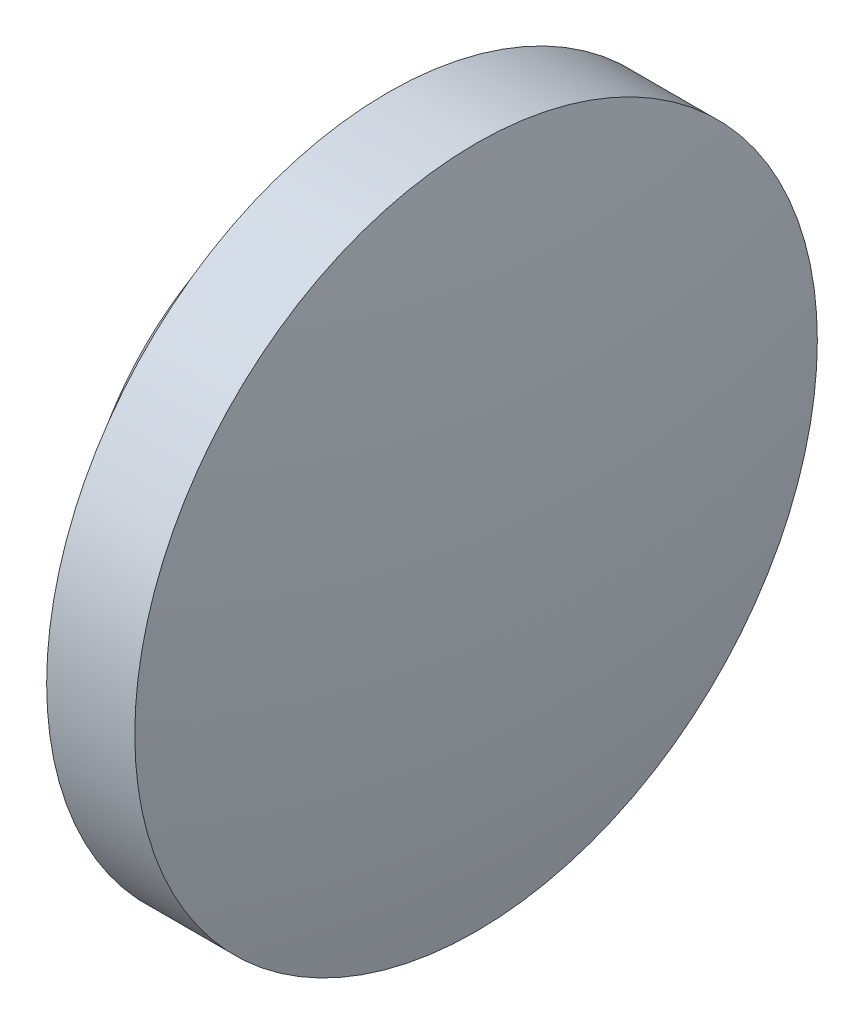
ISO-10303-21;
HEADER;
FILE_DESCRIPTION(('STEP AP214'),'2;1');
FILE_NAME('part.step','',(''),(''),'','','');
FILE_SCHEMA(('AUTOMOTIVE_DESIGN { 1 0 10303 214 1 1 1 1 }'));
ENDSEC;
DATA;
#1=APPLICATION_CONTEXT('core data for automotive mechanical design processes');
#2=APPLICATION_PROTOCOL_DEFINITION('international standard','automotive_design',2000,#1);
#3=PRODUCT_CONTEXT('',#1,'mechanical');
#4=PRODUCT('Part','Part','',(#3));
#5=PRODUCT_RELATED_PRODUCT_CATEGORY('part','',(#4));
#6=PRODUCT_DEFINITION_FORMATION('','',#4);
#7=PRODUCT_DEFINITION_CONTEXT('part definition',#1,'design');
#8=PRODUCT_DEFINITION('design','',#6,#7);
#9=PRODUCT_DEFINITION_SHAPE('','',#8);
#10=(LENGTH_UNIT() NAMED_UNIT(*) SI_UNIT(.MILLI.,.METRE.));
#11=(NAMED_UNIT(*) PLANE_ANGLE_UNIT() SI_UNIT($,.RADIAN.));
#12=(NAMED_UNIT(*) SI_UNIT($,.STERADIAN.) SOLID_ANGLE_UNIT());
#13=UNCERTAINTY_MEASURE_WITH_UNIT(LENGTH_MEASURE(1.E-05),#10,'distance_accuracy_value','');
#14=(GEOMETRIC_REPRESENTATION_CONTEXT(3) GLOBAL_UNCERTAINTY_ASSIGNED_CONTEXT((#13)) GLOBAL_UNIT_ASSIGNED_CONTEXT((#10,
#11,#12)) REPRESENTATION_CONTEXT('',''));
#15=CARTESIAN_POINT('',(0.,0.,0.));
#16=DIRECTION('',(0.,0.,1.));
#17=DIRECTION('',(1.,0.,0.));
#18=AXIS2_PLACEMENT_3D('',#15,#16,#17);
#19=CARTESIAN_POINT('',(-2.655,7.5,0.));
#20=CARTESIAN_POINT('',(-3.00414462672262,6.99347501903168,0.));
#21=CARTESIAN_POINT('',(-3.60732692052335,6.16109742849182,0.));
#22=CARTESIAN_POINT('',(-4.46040443748545,5.01563490150425,0.));
#23=CARTESIAN_POINT('',(-5.128436689168,4.02652892749396,0.));
#24=CARTESIAN_POINT('',(-5.68323649633893,3.02986636031204,0.));
#25=CARTESIAN_POINT('',(-6.20834270212217,1.71114070703199,0.));
#26=CARTESIAN_POINT('',(-6.38301991215058,0.67868265528076,0.));
#27=CARTESIAN_POINT('',(-6.38,0.,0.));
#28=B_SPLINE_CURVE_WITH_KNOTS('',3,(#19,#20,#21,#22,#23,#24,#25,#26,#27),.UNSPECIFIED.,.F.,.F.,
(4,1,1,1,1,1,4),(0.,0.216367397445061,0.361524103508336,0.502322173645188,0.635900790992877,
0.761913848586753,1.),.UNSPECIFIED.);
#29=CARTESIAN_POINT('',(0.,0.,0.));
#30=DIRECTION('',(1.,0.,0.));
#31=AXIS1_PLACEMENT('',#29,#30);
#32=SURFACE_OF_REVOLUTION('',#28,#31);
#33=CARTESIAN_POINT('',(-6.38,0.,0.));
#34=VERTEX_POINT('',#33);
#35=VERTEX_LOOP('',#34);
#36=FACE_BOUND('',#35,.T.);
#37=CARTESIAN_POINT('',(-2.655,0.,0.));
#38=DIRECTION('',(1.,0.,0.));
#39=DIRECTION('',(0.,0.,-1.));
#40=AXIS2_PLACEMENT_3D('',#37,#38,#39);
#41=CIRCLE('',#40,7.5);
#42=CARTESIAN_POINT('',(-2.655,0.,-7.5));
#43=VERTEX_POINT('',#42);
#44=EDGE_CURVE('E38',#43,#43,#41,.T.);
#45=ORIENTED_EDGE('',*,*,#44,.F.);
#46=EDGE_LOOP('',(#45));
#47=FACE_BOUND('',#46,.T.);
#48=ADVANCED_FACE('F31',(#36,#47),#32,.F.);
#49=CARTESIAN_POINT('',(-39.5,0.,0.));
#50=DIRECTION('',(1.,0.,0.));
#51=DIRECTION('',(0.,1.,0.));
#52=AXIS2_PLACEMENT_3D('',#49,#50,#51);
#53=SPHERICAL_SURFACE('',#52,39.5);
#54=CARTESIAN_POINT('',(-0.718561140669371,0.,0.));
#55=DIRECTION('',(1.,0.,0.));
#56=DIRECTION('',(0.,0.,-1.));
#57=AXIS2_PLACEMENT_3D('',#54,#55,#56);
#58=CIRCLE('',#57,7.5);
#59=CARTESIAN_POINT('',(-0.718561140669371,0.,-7.5));
#60=VERTEX_POINT('',#59);
#61=EDGE_CURVE('E11',#60,#60,#58,.T.);
#62=ORIENTED_EDGE('',*,*,#61,.T.);
#63=EDGE_LOOP('',(#62));
#64=FACE_BOUND('',#63,.T.);
#65=ADVANCED_FACE('F43',(#64),#53,.T.);
#66=CARTESIAN_POINT('',(0.,0.,0.));
#67=DIRECTION('',(1.,0.,0.));
#68=DIRECTION('',(0.,0.,-1.));
#69=AXIS2_PLACEMENT_3D('',#66,#67,#68);
#70=CYLINDRICAL_SURFACE('',#69,7.5);
#71=ORIENTED_EDGE('',*,*,#44,.T.);
#72=EDGE_LOOP('',(#71));
#73=FACE_BOUND('',#72,.T.);
#74=ORIENTED_EDGE('',*,*,#61,.F.);
#75=EDGE_LOOP('',(#74));
#76=FACE_BOUND('',#75,.T.);
#77=ADVANCED_FACE('F53',(#73,#76),#70,.T.);
#78=CLOSED_SHELL('',(#48,#65,#77));
#79=MANIFOLD_SOLID_BREP('B2',#78);
#80=ADVANCED_BREP_SHAPE_REPRESENTATION('',(#18,#79),#14);
#81=SHAPE_DEFINITION_REPRESENTATION(#9,#80);
ENDSEC;
END-ISO-10303-21;
